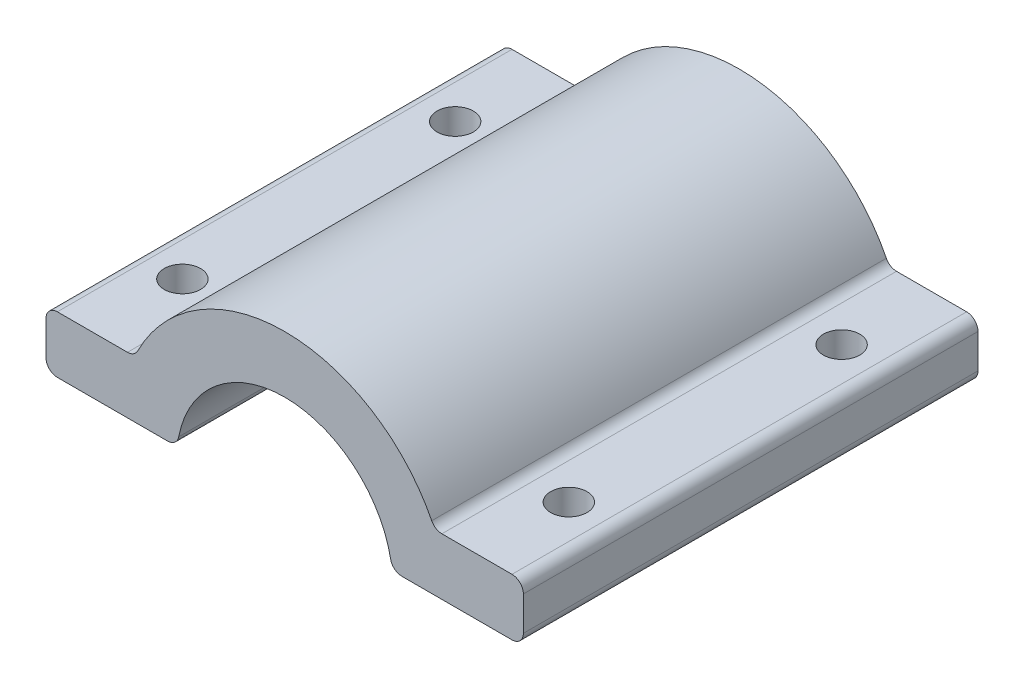
ISO-10303-21;
HEADER;
FILE_DESCRIPTION(('STEP AP214'),'2;1');
FILE_NAME('part.step','',(''),(''),'','','');
FILE_SCHEMA(('AUTOMOTIVE_DESIGN { 1 0 10303 214 1 1 1 1 }'));
ENDSEC;
DATA;
#1=APPLICATION_CONTEXT('core data for automotive mechanical design processes');
#2=APPLICATION_PROTOCOL_DEFINITION('international standard','automotive_design',2000,#1);
#3=PRODUCT_CONTEXT('',#1,'mechanical');
#4=PRODUCT('Part','Part','',(#3));
#5=PRODUCT_RELATED_PRODUCT_CATEGORY('part','',(#4));
#6=PRODUCT_DEFINITION_FORMATION('','',#4);
#7=PRODUCT_DEFINITION_CONTEXT('part definition',#1,'design');
#8=PRODUCT_DEFINITION('design','',#6,#7);
#9=PRODUCT_DEFINITION_SHAPE('','',#8);
#10=(LENGTH_UNIT() NAMED_UNIT(*) SI_UNIT(.MILLI.,.METRE.));
#11=(NAMED_UNIT(*) PLANE_ANGLE_UNIT() SI_UNIT($,.RADIAN.));
#12=(NAMED_UNIT(*) SI_UNIT($,.STERADIAN.) SOLID_ANGLE_UNIT());
#13=UNCERTAINTY_MEASURE_WITH_UNIT(LENGTH_MEASURE(1.E-05),#10,'distance_accuracy_value','');
#14=(GEOMETRIC_REPRESENTATION_CONTEXT(3) GLOBAL_UNCERTAINTY_ASSIGNED_CONTEXT((#13)) GLOBAL_UNIT_ASSIGNED_CONTEXT((#10,
#11,#12)) REPRESENTATION_CONTEXT('',''));
#15=CARTESIAN_POINT('',(0.,0.,0.));
#16=DIRECTION('',(0.,0.,1.));
#17=DIRECTION('',(1.,0.,0.));
#18=AXIS2_PLACEMENT_3D('',#15,#16,#17);
#19=CARTESIAN_POINT('',(13.8293166859393,7.,40.));
#20=DIRECTION('',(0.,0.,-1.));
#21=DIRECTION('',(-1.,0.,0.));
#22=AXIS2_PLACEMENT_3D('',#19,#20,#21);
#23=CYLINDRICAL_SURFACE('',#22,1.);
#24=CARTESIAN_POINT('',(13.8293166859393,7.,0.));
#25=DIRECTION('',(0.,0.,-1.));
#26=DIRECTION('',(1.,0.,0.));
#27=AXIS2_PLACEMENT_3D('',#24,#25,#26);
#28=CIRCLE('',#27,1.);
#29=CARTESIAN_POINT('',(13.8293166859393,6.,0.));
#30=VERTEX_POINT('',#29);
#31=CARTESIAN_POINT('',(12.9371027062013,6.54838709677419,0.));
#32=VERTEX_POINT('',#31);
#33=EDGE_CURVE('E183',#30,#32,#28,.T.);
#34=ORIENTED_EDGE('',*,*,#33,.T.);
#35=DIRECTION('',(0.,0.,-1.));
#36=VECTOR('',#35,1.);
#37=CARTESIAN_POINT('',(12.9371027062013,6.54838709677419,40.));
#38=LINE('',#37,#36);
#39=CARTESIAN_POINT('',(12.9371027062013,6.54838709677419,40.));
#40=VERTEX_POINT('',#39);
#41=EDGE_CURVE('E11',#40,#32,#38,.T.);
#42=ORIENTED_EDGE('',*,*,#41,.F.);
#43=CARTESIAN_POINT('',(13.8293166859393,7.,40.));
#44=DIRECTION('',(0.,0.,-1.));
#45=DIRECTION('',(1.,0.,0.));
#46=AXIS2_PLACEMENT_3D('',#43,#44,#45);
#47=CIRCLE('',#46,1.);
#48=CARTESIAN_POINT('',(13.8293166859393,6.,40.));
#49=VERTEX_POINT('',#48);
#50=EDGE_CURVE('E215',#49,#40,#47,.T.);
#51=ORIENTED_EDGE('',*,*,#50,.F.);
#52=DIRECTION('',(0.,0.,-1.));
#53=VECTOR('',#52,1.);
#54=CARTESIAN_POINT('',(13.8293166859393,6.,40.));
#55=LINE('',#54,#53);
#56=EDGE_CURVE('E179',#49,#30,#55,.T.);
#57=ORIENTED_EDGE('',*,*,#56,.T.);
#58=EDGE_LOOP('',(#34,#42,#51,#57));
#59=FACE_BOUND('',#58,.T.);
#60=ADVANCED_FACE('F37',(#59),#23,.F.);
#61=CARTESIAN_POINT('',(0.,0.,40.));
#62=DIRECTION('',(0.,0.,-1.));
#63=DIRECTION('',(-1.,0.,0.));
#64=AXIS2_PLACEMENT_3D('',#61,#62,#63);
#65=CYLINDRICAL_SURFACE('',#64,14.5);
#66=CARTESIAN_POINT('',(0.,0.,0.));
#67=DIRECTION('',(0.,0.,1.));
#68=DIRECTION('',(1.,0.,0.));
#69=AXIS2_PLACEMENT_3D('',#66,#67,#68);
#70=CIRCLE('',#69,14.5);
#71=CARTESIAN_POINT('',(-12.9371027062013,6.54838709677419,0.));
#72=VERTEX_POINT('',#71);
#73=EDGE_CURVE('E186',#32,#72,#70,.T.);
#74=ORIENTED_EDGE('',*,*,#73,.T.);
#75=DIRECTION('',(0.,0.,-1.));
#76=VECTOR('',#75,1.);
#77=CARTESIAN_POINT('',(-12.9371027062013,6.54838709677419,40.));
#78=LINE('',#77,#76);
#79=CARTESIAN_POINT('',(-12.9371027062013,6.54838709677419,40.));
#80=VERTEX_POINT('',#79);
#81=EDGE_CURVE('E46',#80,#72,#78,.T.);
#82=ORIENTED_EDGE('',*,*,#81,.F.);
#83=CARTESIAN_POINT('',(0.,0.,40.));
#84=DIRECTION('',(0.,0.,1.));
#85=DIRECTION('',(1.,0.,0.));
#86=AXIS2_PLACEMENT_3D('',#83,#84,#85);
#87=CIRCLE('',#86,14.5);
#88=EDGE_CURVE('E122',#40,#80,#87,.T.);
#89=ORIENTED_EDGE('',*,*,#88,.F.);
#90=ORIENTED_EDGE('',*,*,#41,.T.);
#91=EDGE_LOOP('',(#74,#82,#89,#90));
#92=FACE_BOUND('',#91,.T.);
#93=ADVANCED_FACE('F317',(#92),#65,.T.);
#94=CARTESIAN_POINT('',(-13.8293166859393,7.,40.));
#95=DIRECTION('',(0.,0.,-1.));
#96=DIRECTION('',(-1.,0.,0.));
#97=AXIS2_PLACEMENT_3D('',#94,#95,#96);
#98=CYLINDRICAL_SURFACE('',#97,1.);
#99=CARTESIAN_POINT('',(-13.8293166859393,7.,0.));
#100=DIRECTION('',(0.,0.,-1.));
#101=DIRECTION('',(1.,0.,0.));
#102=AXIS2_PLACEMENT_3D('',#99,#100,#101);
#103=CIRCLE('',#102,1.);
#104=CARTESIAN_POINT('',(-13.8293166859393,6.,0.));
#105=VERTEX_POINT('',#104);
#106=EDGE_CURVE('E188',#72,#105,#103,.T.);
#107=ORIENTED_EDGE('',*,*,#106,.T.);
#108=DIRECTION('',(0.,0.,-1.));
#109=VECTOR('',#108,1.);
#110=CARTESIAN_POINT('',(-13.8293166859393,6.,40.));
#111=LINE('',#110,#109);
#112=CARTESIAN_POINT('',(-13.8293166859393,6.,40.));
#113=VERTEX_POINT('',#112);
#114=EDGE_CURVE('E246',#113,#105,#111,.T.);
#115=ORIENTED_EDGE('',*,*,#114,.F.);
#116=CARTESIAN_POINT('',(-13.8293166859393,7.,40.));
#117=DIRECTION('',(0.,0.,-1.));
#118=DIRECTION('',(1.,0.,0.));
#119=AXIS2_PLACEMENT_3D('',#116,#117,#118);
#120=CIRCLE('',#119,1.);
#121=EDGE_CURVE('E268',#80,#113,#120,.T.);
#122=ORIENTED_EDGE('',*,*,#121,.F.);
#123=ORIENTED_EDGE('',*,*,#81,.T.);
#124=EDGE_LOOP('',(#107,#115,#122,#123));
#125=FACE_BOUND('',#124,.T.);
#126=ADVANCED_FACE('F321',(#125),#98,.F.);
#127=CARTESIAN_POINT('',(-20.,6.,40.));
#128=DIRECTION('',(0.,-1.,0.));
#129=DIRECTION('',(0.,0.,-1.));
#130=AXIS2_PLACEMENT_3D('',#127,#128,#129);
#131=PLANE('',#130);
#132=CARTESIAN_POINT('',(-17.,6.,32.));
#133=DIRECTION('',(0.,1.,0.));
#134=DIRECTION('',(0.,0.,1.));
#135=AXIS2_PLACEMENT_3D('',#132,#133,#134);
#136=CIRCLE('',#135,1.60000000000001);
#137=CARTESIAN_POINT('',(-17.,6.,33.6));
#138=VERTEX_POINT('',#137);
#139=EDGE_CURVE('E461',#138,#138,#136,.T.);
#140=ORIENTED_EDGE('',*,*,#139,.F.);
#141=EDGE_LOOP('',(#140));
#142=FACE_BOUND('',#141,.T.);
#143=CARTESIAN_POINT('',(-17.,6.,8.));
#144=DIRECTION('',(0.,1.,0.));
#145=DIRECTION('',(0.,0.,1.));
#146=AXIS2_PLACEMENT_3D('',#143,#144,#145);
#147=CIRCLE('',#146,1.6);
#148=CARTESIAN_POINT('',(-17.,6.,9.6));
#149=VERTEX_POINT('',#148);
#150=EDGE_CURVE('E262',#149,#149,#147,.T.);
#151=ORIENTED_EDGE('',*,*,#150,.F.);
#152=EDGE_LOOP('',(#151));
#153=FACE_BOUND('',#152,.T.);
#154=DIRECTION('',(-1.,0.,0.));
#155=VECTOR('',#154,1.);
#156=CARTESIAN_POINT('',(-20.,6.,0.));
#157=LINE('',#156,#155);
#158=CARTESIAN_POINT('',(-20.,6.,0.));
#159=VERTEX_POINT('',#158);
#160=EDGE_CURVE('E190',#105,#159,#157,.T.);
#161=ORIENTED_EDGE('',*,*,#160,.T.);
#162=DIRECTION('',(0.,0.,-1.));
#163=VECTOR('',#162,1.);
#164=CARTESIAN_POINT('',(-20.,6.,40.));
#165=LINE('',#164,#163);
#166=CARTESIAN_POINT('',(-20.,6.,40.));
#167=VERTEX_POINT('',#166);
#168=EDGE_CURVE('E243',#167,#159,#165,.T.);
#169=ORIENTED_EDGE('',*,*,#168,.F.);
#170=DIRECTION('',(-1.,0.,0.));
#171=VECTOR('',#170,1.);
#172=CARTESIAN_POINT('',(-20.,6.,40.));
#173=LINE('',#172,#171);
#174=EDGE_CURVE('E270',#113,#167,#173,.T.);
#175=ORIENTED_EDGE('',*,*,#174,.F.);
#176=ORIENTED_EDGE('',*,*,#114,.T.);
#177=EDGE_LOOP('',(#161,#169,#175,#176));
#178=FACE_BOUND('',#177,.T.);
#179=ADVANCED_FACE('F325',(#142,#153,#178),#131,.F.);
#180=CARTESIAN_POINT('',(-20.,5.,40.));
#181=DIRECTION('',(0.,0.,-1.));
#182=DIRECTION('',(-1.,0.,0.));
#183=AXIS2_PLACEMENT_3D('',#180,#181,#182);
#184=CYLINDRICAL_SURFACE('',#183,1.);
#185=CARTESIAN_POINT('',(-20.,5.,0.));
#186=DIRECTION('',(0.,0.,1.));
#187=DIRECTION('',(1.,0.,0.));
#188=AXIS2_PLACEMENT_3D('',#185,#186,#187);
#189=CIRCLE('',#188,1.);
#190=CARTESIAN_POINT('',(-21.,5.,0.));
#191=VERTEX_POINT('',#190);
#192=EDGE_CURVE('E192',#159,#191,#189,.T.);
#193=ORIENTED_EDGE('',*,*,#192,.T.);
#194=DIRECTION('',(0.,0.,-1.));
#195=VECTOR('',#194,1.);
#196=CARTESIAN_POINT('',(-21.,5.,40.));
#197=LINE('',#196,#195);
#198=CARTESIAN_POINT('',(-21.,5.,40.));
#199=VERTEX_POINT('',#198);
#200=EDGE_CURVE('E240',#199,#191,#197,.T.);
#201=ORIENTED_EDGE('',*,*,#200,.F.);
#202=CARTESIAN_POINT('',(-20.,5.,40.));
#203=DIRECTION('',(0.,0.,1.));
#204=DIRECTION('',(1.,0.,0.));
#205=AXIS2_PLACEMENT_3D('',#202,#203,#204);
#206=CIRCLE('',#205,1.);
#207=EDGE_CURVE('E272',#167,#199,#206,.T.);
#208=ORIENTED_EDGE('',*,*,#207,.F.);
#209=ORIENTED_EDGE('',*,*,#168,.T.);
#210=EDGE_LOOP('',(#193,#201,#208,#209));
#211=FACE_BOUND('',#210,.T.);
#212=ADVANCED_FACE('F331',(#211),#184,.T.);
#213=CARTESIAN_POINT('',(-21.,5.,40.));
#214=DIRECTION('',(1.,0.,0.));
#215=DIRECTION('',(0.,0.,-1.));
#216=AXIS2_PLACEMENT_3D('',#213,#214,#215);
#217=PLANE('',#216);
#218=DIRECTION('',(0.,-1.,0.));
#219=VECTOR('',#218,1.);
#220=CARTESIAN_POINT('',(-21.,5.,0.));
#221=LINE('',#220,#219);
#222=CARTESIAN_POINT('',(-21.,2.,0.));
#223=VERTEX_POINT('',#222);
#224=EDGE_CURVE('E194',#191,#223,#221,.T.);
#225=ORIENTED_EDGE('',*,*,#224,.T.);
#226=DIRECTION('',(0.,0.,-1.));
#227=VECTOR('',#226,1.);
#228=CARTESIAN_POINT('',(-21.,2.,40.));
#229=LINE('',#228,#227);
#230=CARTESIAN_POINT('',(-21.,2.,40.));
#231=VERTEX_POINT('',#230);
#232=EDGE_CURVE('E237',#231,#223,#229,.T.);
#233=ORIENTED_EDGE('',*,*,#232,.F.);
#234=DIRECTION('',(0.,-1.,0.));
#235=VECTOR('',#234,1.);
#236=CARTESIAN_POINT('',(-21.,5.,40.));
#237=LINE('',#236,#235);
#238=EDGE_CURVE('E274',#199,#231,#237,.T.);
#239=ORIENTED_EDGE('',*,*,#238,.F.);
#240=ORIENTED_EDGE('',*,*,#200,.T.);
#241=EDGE_LOOP('',(#225,#233,#239,#240));
#242=FACE_BOUND('',#241,.T.);
#243=ADVANCED_FACE('F335',(#242),#217,.F.);
#244=CARTESIAN_POINT('',(-20.,2.,40.));
#245=DIRECTION('',(0.,0.,-1.));
#246=DIRECTION('',(-1.,0.,0.));
#247=AXIS2_PLACEMENT_3D('',#244,#245,#246);
#248=CYLINDRICAL_SURFACE('',#247,1.);
#249=CARTESIAN_POINT('',(-20.,2.,0.));
#250=DIRECTION('',(0.,0.,1.));
#251=DIRECTION('',(1.,0.,0.));
#252=AXIS2_PLACEMENT_3D('',#249,#250,#251);
#253=CIRCLE('',#252,1.);
#254=CARTESIAN_POINT('',(-20.,1.,0.));
#255=VERTEX_POINT('',#254);
#256=EDGE_CURVE('E196',#223,#255,#253,.T.);
#257=ORIENTED_EDGE('',*,*,#256,.T.);
#258=DIRECTION('',(0.,0.,-1.));
#259=VECTOR('',#258,1.);
#260=CARTESIAN_POINT('',(-20.,1.,40.));
#261=LINE('',#260,#259);
#262=CARTESIAN_POINT('',(-20.,1.,40.));
#263=VERTEX_POINT('',#262);
#264=EDGE_CURVE('E234',#263,#255,#261,.T.);
#265=ORIENTED_EDGE('',*,*,#264,.F.);
#266=CARTESIAN_POINT('',(-20.,2.,40.));
#267=DIRECTION('',(0.,0.,1.));
#268=DIRECTION('',(1.,0.,0.));
#269=AXIS2_PLACEMENT_3D('',#266,#267,#268);
#270=CIRCLE('',#269,1.);
#271=EDGE_CURVE('E276',#231,#263,#270,.T.);
#272=ORIENTED_EDGE('',*,*,#271,.F.);
#273=ORIENTED_EDGE('',*,*,#232,.T.);
#274=EDGE_LOOP('',(#257,#265,#272,#273));
#275=FACE_BOUND('',#274,.T.);
#276=ADVANCED_FACE('F339',(#275),#248,.T.);
#277=CARTESIAN_POINT('',(-14.4654761414894,1.,40.));
#278=DIRECTION('',(0.,1.,0.));
#279=DIRECTION('',(0.,0.,1.));
#280=AXIS2_PLACEMENT_3D('',#277,#278,#279);
#281=PLANE('',#280);
#282=CARTESIAN_POINT('',(-17.,1.,32.));
#283=DIRECTION('',(0.,1.,0.));
#284=DIRECTION('',(0.,0.,1.));
#285=AXIS2_PLACEMENT_3D('',#282,#283,#284);
#286=CIRCLE('',#285,1.60000000000001);
#287=CARTESIAN_POINT('',(-17.,1.,33.6));
#288=VERTEX_POINT('',#287);
#289=EDGE_CURVE('E40',#288,#288,#286,.T.);
#290=ORIENTED_EDGE('',*,*,#289,.T.);
#291=EDGE_LOOP('',(#290));
#292=FACE_BOUND('',#291,.T.);
#293=CARTESIAN_POINT('',(-17.,1.,8.));
#294=DIRECTION('',(0.,1.,0.));
#295=DIRECTION('',(0.,0.,1.));
#296=AXIS2_PLACEMENT_3D('',#293,#294,#295);
#297=CIRCLE('',#296,1.6);
#298=CARTESIAN_POINT('',(-17.,1.,9.6));
#299=VERTEX_POINT('',#298);
#300=EDGE_CURVE('E250',#299,#299,#297,.T.);
#301=ORIENTED_EDGE('',*,*,#300,.T.);
#302=EDGE_LOOP('',(#301));
#303=FACE_BOUND('',#302,.T.);
#304=DIRECTION('',(1.,0.,0.));
#305=VECTOR('',#304,1.);
#306=CARTESIAN_POINT('',(-14.4654761414894,1.,0.));
#307=LINE('',#306,#305);
#308=CARTESIAN_POINT('',(-10.3077640640442,1.,0.));
#309=VERTEX_POINT('',#308);
#310=EDGE_CURVE('E199',#255,#309,#307,.T.);
#311=ORIENTED_EDGE('',*,*,#310,.T.);
#312=DIRECTION('',(0.,0.,-1.));
#313=VECTOR('',#312,1.);
#314=CARTESIAN_POINT('',(-10.3077640640442,1.,40.));
#315=LINE('',#314,#313);
#316=CARTESIAN_POINT('',(-10.3077640640442,1.,40.));
#317=VERTEX_POINT('',#316);
#318=EDGE_CURVE('E231',#317,#309,#315,.T.);
#319=ORIENTED_EDGE('',*,*,#318,.F.);
#320=DIRECTION('',(1.,0.,0.));
#321=VECTOR('',#320,1.);
#322=CARTESIAN_POINT('',(-20.,1.,40.));
#323=LINE('',#322,#321);
#324=EDGE_CURVE('E278',#263,#317,#323,.T.);
#325=ORIENTED_EDGE('',*,*,#324,.F.);
#326=ORIENTED_EDGE('',*,*,#264,.T.);
#327=EDGE_LOOP('',(#311,#319,#325,#326));
#328=FACE_BOUND('',#327,.T.);
#329=ADVANCED_FACE('F343',(#292,#303,#328),#281,.F.);
#330=CARTESIAN_POINT('',(-10.3077640640442,2.,40.));
#331=DIRECTION('',(0.,0.,-1.));
#332=DIRECTION('',(-1.,0.,0.));
#333=AXIS2_PLACEMENT_3D('',#330,#331,#332);
#334=CYLINDRICAL_SURFACE('',#333,1.);
#335=CARTESIAN_POINT('',(-10.3077640640442,2.,0.));
#336=DIRECTION('',(0.,0.,1.));
#337=DIRECTION('',(-1.,0.,0.));
#338=AXIS2_PLACEMENT_3D('',#335,#336,#337);
#339=CIRCLE('',#338,1.);
#340=CARTESIAN_POINT('',(-9.3260722484209,1.80952380952381,0.));
#341=VERTEX_POINT('',#340);
#342=EDGE_CURVE('E201',#309,#341,#339,.T.);
#343=ORIENTED_EDGE('',*,*,#342,.T.);
#344=DIRECTION('',(0.,0.,-1.));
#345=VECTOR('',#344,1.);
#346=CARTESIAN_POINT('',(-9.3260722484209,1.80952380952381,40.));
#347=LINE('',#346,#345);
#348=CARTESIAN_POINT('',(-9.3260722484209,1.80952380952381,40.));
#349=VERTEX_POINT('',#348);
#350=EDGE_CURVE('E228',#349,#341,#347,.T.);
#351=ORIENTED_EDGE('',*,*,#350,.F.);
#352=CARTESIAN_POINT('',(-10.3077640640442,2.,40.));
#353=DIRECTION('',(0.,0.,1.));
#354=DIRECTION('',(-1.,0.,0.));
#355=AXIS2_PLACEMENT_3D('',#352,#353,#354);
#356=CIRCLE('',#355,1.);
#357=EDGE_CURVE('E280',#317,#349,#356,.T.);
#358=ORIENTED_EDGE('',*,*,#357,.F.);
#359=ORIENTED_EDGE('',*,*,#318,.T.);
#360=EDGE_LOOP('',(#343,#351,#358,#359));
#361=FACE_BOUND('',#360,.T.);
#362=ADVANCED_FACE('F347',(#361),#334,.T.);
#363=CARTESIAN_POINT('',(0.,0.,40.));
#364=DIRECTION('',(0.,0.,-1.));
#365=DIRECTION('',(-1.,0.,0.));
#366=AXIS2_PLACEMENT_3D('',#363,#364,#365);
#367=CYLINDRICAL_SURFACE('',#366,9.5);
#368=CARTESIAN_POINT('',(0.,0.,0.));
#369=DIRECTION('',(0.,0.,-1.));
#370=DIRECTION('',(1.,0.,0.));
#371=AXIS2_PLACEMENT_3D('',#368,#369,#370);
#372=CIRCLE('',#371,9.5);
#373=CARTESIAN_POINT('',(9.3260722484209,1.80952380952381,0.));
#374=VERTEX_POINT('',#373);
#375=EDGE_CURVE('E203',#341,#374,#372,.T.);
#376=ORIENTED_EDGE('',*,*,#375,.T.);
#377=DIRECTION('',(0.,0.,-1.));
#378=VECTOR('',#377,1.);
#379=CARTESIAN_POINT('',(9.3260722484209,1.80952380952381,40.));
#380=LINE('',#379,#378);
#381=CARTESIAN_POINT('',(9.3260722484209,1.80952380952381,40.));
#382=VERTEX_POINT('',#381);
#383=EDGE_CURVE('E225',#382,#374,#380,.T.);
#384=ORIENTED_EDGE('',*,*,#383,.F.);
#385=CARTESIAN_POINT('',(0.,0.,40.));
#386=DIRECTION('',(0.,0.,-1.));
#387=DIRECTION('',(1.,0.,0.));
#388=AXIS2_PLACEMENT_3D('',#385,#386,#387);
#389=CIRCLE('',#388,9.5);
#390=EDGE_CURVE('E282',#349,#382,#389,.T.);
#391=ORIENTED_EDGE('',*,*,#390,.F.);
#392=ORIENTED_EDGE('',*,*,#350,.T.);
#393=EDGE_LOOP('',(#376,#384,#391,#392));
#394=FACE_BOUND('',#393,.T.);
#395=ADVANCED_FACE('F351',(#394),#367,.F.);
#396=CARTESIAN_POINT('',(10.3077640640442,2.,40.));
#397=DIRECTION('',(0.,0.,-1.));
#398=DIRECTION('',(-1.,0.,0.));
#399=AXIS2_PLACEMENT_3D('',#396,#397,#398);
#400=CYLINDRICAL_SURFACE('',#399,1.);
#401=CARTESIAN_POINT('',(10.3077640640442,2.,0.));
#402=DIRECTION('',(0.,0.,1.));
#403=DIRECTION('',(1.,0.,0.));
#404=AXIS2_PLACEMENT_3D('',#401,#402,#403);
#405=CIRCLE('',#404,1.);
#406=CARTESIAN_POINT('',(10.3077640640442,1.,0.));
#407=VERTEX_POINT('',#406);
#408=EDGE_CURVE('E205',#374,#407,#405,.T.);
#409=ORIENTED_EDGE('',*,*,#408,.T.);
#410=DIRECTION('',(0.,0.,-1.));
#411=VECTOR('',#410,1.);
#412=CARTESIAN_POINT('',(10.3077640640442,1.,40.));
#413=LINE('',#412,#411);
#414=CARTESIAN_POINT('',(10.3077640640442,1.,40.));
#415=VERTEX_POINT('',#414);
#416=EDGE_CURVE('E222',#415,#407,#413,.T.);
#417=ORIENTED_EDGE('',*,*,#416,.F.);
#418=CARTESIAN_POINT('',(10.3077640640442,2.,40.));
#419=DIRECTION('',(0.,0.,1.));
#420=DIRECTION('',(1.,0.,0.));
#421=AXIS2_PLACEMENT_3D('',#418,#419,#420);
#422=CIRCLE('',#421,1.);
#423=EDGE_CURVE('E284',#382,#415,#422,.T.);
#424=ORIENTED_EDGE('',*,*,#423,.F.);
#425=ORIENTED_EDGE('',*,*,#383,.T.);
#426=EDGE_LOOP('',(#409,#417,#424,#425));
#427=FACE_BOUND('',#426,.T.);
#428=ADVANCED_FACE('F355',(#427),#400,.T.);
#429=CARTESIAN_POINT('',(20.,1.,40.));
#430=DIRECTION('',(0.,1.,0.));
#431=DIRECTION('',(-1.,0.,0.));
#432=AXIS2_PLACEMENT_3D('',#429,#430,#431);
#433=PLANE('',#432);
#434=CARTESIAN_POINT('',(17.,1.,32.));
#435=DIRECTION('',(0.,1.,0.));
#436=DIRECTION('',(-1.,0.,0.));
#437=AXIS2_PLACEMENT_3D('',#434,#435,#436);
#438=CIRCLE('',#437,1.6);
#439=CARTESIAN_POINT('',(15.4,1.,32.));
#440=VERTEX_POINT('',#439);
#441=EDGE_CURVE('E252',#440,#440,#438,.T.);
#442=ORIENTED_EDGE('',*,*,#441,.T.);
#443=EDGE_LOOP('',(#442));
#444=FACE_BOUND('',#443,.T.);
#445=CARTESIAN_POINT('',(17.,1.,8.));
#446=DIRECTION('',(0.,1.,0.));
#447=DIRECTION('',(-1.,0.,0.));
#448=AXIS2_PLACEMENT_3D('',#445,#446,#447);
#449=CIRCLE('',#448,1.6);
#450=CARTESIAN_POINT('',(15.4,1.,8.));
#451=VERTEX_POINT('',#450);
#452=EDGE_CURVE('E257',#451,#451,#449,.T.);
#453=ORIENTED_EDGE('',*,*,#452,.T.);
#454=EDGE_LOOP('',(#453));
#455=FACE_BOUND('',#454,.T.);
#456=DIRECTION('',(1.,0.,0.));
#457=VECTOR('',#456,1.);
#458=CARTESIAN_POINT('',(20.,1.,0.));
#459=LINE('',#458,#457);
#460=CARTESIAN_POINT('',(20.,1.,0.));
#461=VERTEX_POINT('',#460);
#462=EDGE_CURVE('E208',#407,#461,#459,.T.);
#463=ORIENTED_EDGE('',*,*,#462,.T.);
#464=DIRECTION('',(0.,0.,-1.));
#465=VECTOR('',#464,1.);
#466=CARTESIAN_POINT('',(20.,1.,40.));
#467=LINE('',#466,#465);
#468=CARTESIAN_POINT('',(20.,1.,40.));
#469=VERTEX_POINT('',#468);
#470=EDGE_CURVE('E219',#469,#461,#467,.T.);
#471=ORIENTED_EDGE('',*,*,#470,.F.);
#472=DIRECTION('',(1.,0.,0.));
#473=VECTOR('',#472,1.);
#474=CARTESIAN_POINT('',(10.3077640640442,1.,40.));
#475=LINE('',#474,#473);
#476=EDGE_CURVE('E286',#415,#469,#475,.T.);
#477=ORIENTED_EDGE('',*,*,#476,.F.);
#478=ORIENTED_EDGE('',*,*,#416,.T.);
#479=EDGE_LOOP('',(#463,#471,#477,#478));
#480=FACE_BOUND('',#479,.T.);
#481=ADVANCED_FACE('F292',(#444,#455,#480),#433,.F.);
#482=CARTESIAN_POINT('',(20.,2.,40.));
#483=DIRECTION('',(0.,0.,-1.));
#484=DIRECTION('',(-1.,0.,0.));
#485=AXIS2_PLACEMENT_3D('',#482,#483,#484);
#486=CYLINDRICAL_SURFACE('',#485,1.);
#487=CARTESIAN_POINT('',(20.,2.,0.));
#488=DIRECTION('',(0.,0.,1.));
#489=DIRECTION('',(1.,0.,0.));
#490=AXIS2_PLACEMENT_3D('',#487,#488,#489);
#491=CIRCLE('',#490,1.);
#492=CARTESIAN_POINT('',(21.,2.,0.));
#493=VERTEX_POINT('',#492);
#494=EDGE_CURVE('E210',#461,#493,#491,.T.);
#495=ORIENTED_EDGE('',*,*,#494,.T.);
#496=DIRECTION('',(0.,0.,-1.));
#497=VECTOR('',#496,1.);
#498=CARTESIAN_POINT('',(21.,2.,40.));
#499=LINE('',#498,#497);
#500=CARTESIAN_POINT('',(21.,2.,40.));
#501=VERTEX_POINT('',#500);
#502=EDGE_CURVE('E174',#501,#493,#499,.T.);
#503=ORIENTED_EDGE('',*,*,#502,.F.);
#504=CARTESIAN_POINT('',(20.,2.,40.));
#505=DIRECTION('',(0.,0.,1.));
#506=DIRECTION('',(1.,0.,0.));
#507=AXIS2_PLACEMENT_3D('',#504,#505,#506);
#508=CIRCLE('',#507,1.);
#509=EDGE_CURVE('E165',#469,#501,#508,.T.);
#510=ORIENTED_EDGE('',*,*,#509,.F.);
#511=ORIENTED_EDGE('',*,*,#470,.T.);
#512=EDGE_LOOP('',(#495,#503,#510,#511));
#513=FACE_BOUND('',#512,.T.);
#514=ADVANCED_FACE('F295',(#513),#486,.T.);
#515=CARTESIAN_POINT('',(21.,5.,40.));
#516=DIRECTION('',(-1.,0.,0.));
#517=DIRECTION('',(0.,0.,1.));
#518=AXIS2_PLACEMENT_3D('',#515,#516,#517);
#519=PLANE('',#518);
#520=DIRECTION('',(0.,1.,0.));
#521=VECTOR('',#520,1.);
#522=CARTESIAN_POINT('',(21.,5.,0.));
#523=LINE('',#522,#521);
#524=CARTESIAN_POINT('',(21.,5.,0.));
#525=VERTEX_POINT('',#524);
#526=EDGE_CURVE('E173',#493,#525,#523,.T.);
#527=ORIENTED_EDGE('',*,*,#526,.T.);
#528=DIRECTION('',(0.,0.,-1.));
#529=VECTOR('',#528,1.);
#530=CARTESIAN_POINT('',(21.,5.,40.));
#531=LINE('',#530,#529);
#532=CARTESIAN_POINT('',(21.,5.,40.));
#533=VERTEX_POINT('',#532);
#534=EDGE_CURVE('E170',#533,#525,#531,.T.);
#535=ORIENTED_EDGE('',*,*,#534,.F.);
#536=DIRECTION('',(0.,1.,0.));
#537=VECTOR('',#536,1.);
#538=CARTESIAN_POINT('',(21.,5.,40.));
#539=LINE('',#538,#537);
#540=EDGE_CURVE('E159',#501,#533,#539,.T.);
#541=ORIENTED_EDGE('',*,*,#540,.F.);
#542=ORIENTED_EDGE('',*,*,#502,.T.);
#543=EDGE_LOOP('',(#527,#535,#541,#542));
#544=FACE_BOUND('',#543,.T.);
#545=ADVANCED_FACE('F171',(#544),#519,.F.);
#546=CARTESIAN_POINT('',(20.,5.,40.));
#547=DIRECTION('',(0.,0.,-1.));
#548=DIRECTION('',(-1.,0.,0.));
#549=AXIS2_PLACEMENT_3D('',#546,#547,#548);
#550=CYLINDRICAL_SURFACE('',#549,1.);
#551=CARTESIAN_POINT('',(20.,5.,0.));
#552=DIRECTION('',(0.,0.,1.));
#553=DIRECTION('',(1.,0.,0.));
#554=AXIS2_PLACEMENT_3D('',#551,#552,#553);
#555=CIRCLE('',#554,1.);
#556=CARTESIAN_POINT('',(20.,6.,0.));
#557=VERTEX_POINT('',#556);
#558=EDGE_CURVE('E108',#525,#557,#555,.T.);
#559=ORIENTED_EDGE('',*,*,#558,.T.);
#560=DIRECTION('',(0.,0.,-1.));
#561=VECTOR('',#560,1.);
#562=CARTESIAN_POINT('',(20.,6.,40.));
#563=LINE('',#562,#561);
#564=CARTESIAN_POINT('',(20.,6.,40.));
#565=VERTEX_POINT('',#564);
#566=EDGE_CURVE('E175',#565,#557,#563,.T.);
#567=ORIENTED_EDGE('',*,*,#566,.F.);
#568=CARTESIAN_POINT('',(20.,5.,40.));
#569=DIRECTION('',(0.,0.,1.));
#570=DIRECTION('',(1.,0.,0.));
#571=AXIS2_PLACEMENT_3D('',#568,#569,#570);
#572=CIRCLE('',#571,1.);
#573=EDGE_CURVE('E163',#533,#565,#572,.T.);
#574=ORIENTED_EDGE('',*,*,#573,.F.);
#575=ORIENTED_EDGE('',*,*,#534,.T.);
#576=EDGE_LOOP('',(#559,#567,#574,#575));
#577=FACE_BOUND('',#576,.T.);
#578=ADVANCED_FACE('F177',(#577),#550,.T.);
#579=CARTESIAN_POINT('',(20.,6.,40.));
#580=DIRECTION('',(0.,-1.,0.));
#581=DIRECTION('',(0.,0.,-1.));
#582=AXIS2_PLACEMENT_3D('',#579,#580,#581);
#583=PLANE('',#582);
#584=CARTESIAN_POINT('',(17.,6.,32.));
#585=DIRECTION('',(0.,1.,0.));
#586=DIRECTION('',(0.,0.,1.));
#587=AXIS2_PLACEMENT_3D('',#584,#585,#586);
#588=CIRCLE('',#587,1.6);
#589=CARTESIAN_POINT('',(17.,6.,33.6));
#590=VERTEX_POINT('',#589);
#591=EDGE_CURVE('E488',#590,#590,#588,.T.);
#592=ORIENTED_EDGE('',*,*,#591,.F.);
#593=EDGE_LOOP('',(#592));
#594=FACE_BOUND('',#593,.T.);
#595=CARTESIAN_POINT('',(17.,6.,8.));
#596=DIRECTION('',(0.,1.,0.));
#597=DIRECTION('',(0.,0.,1.));
#598=AXIS2_PLACEMENT_3D('',#595,#596,#597);
#599=CIRCLE('',#598,1.6);
#600=CARTESIAN_POINT('',(17.,6.,9.6));
#601=VERTEX_POINT('',#600);
#602=EDGE_CURVE('E491',#601,#601,#599,.T.);
#603=ORIENTED_EDGE('',*,*,#602,.F.);
#604=EDGE_LOOP('',(#603));
#605=FACE_BOUND('',#604,.T.);
#606=DIRECTION('',(-1.,0.,0.));
#607=VECTOR('',#606,1.);
#608=CARTESIAN_POINT('',(20.,6.,0.));
#609=LINE('',#608,#607);
#610=EDGE_CURVE('E114',#557,#30,#609,.T.);
#611=ORIENTED_EDGE('',*,*,#610,.T.);
#612=ORIENTED_EDGE('',*,*,#56,.F.);
#613=DIRECTION('',(-1.,0.,0.));
#614=VECTOR('',#613,1.);
#615=CARTESIAN_POINT('',(20.,6.,40.));
#616=LINE('',#615,#614);
#617=EDGE_CURVE('E55',#565,#49,#616,.T.);
#618=ORIENTED_EDGE('',*,*,#617,.F.);
#619=ORIENTED_EDGE('',*,*,#566,.T.);
#620=EDGE_LOOP('',(#611,#612,#618,#619));
#621=FACE_BOUND('',#620,.T.);
#622=ADVANCED_FACE('F303',(#594,#605,#621),#583,.F.);
#623=CARTESIAN_POINT('',(13.8293166859393,7.,40.));
#624=DIRECTION('',(0.,0.,1.));
#625=DIRECTION('',(1.,0.,0.));
#626=AXIS2_PLACEMENT_3D('',#623,#624,#625);
#627=PLANE('',#626);
#628=ORIENTED_EDGE('',*,*,#50,.T.);
#629=ORIENTED_EDGE('',*,*,#88,.T.);
#630=ORIENTED_EDGE('',*,*,#121,.T.);
#631=ORIENTED_EDGE('',*,*,#174,.T.);
#632=ORIENTED_EDGE('',*,*,#207,.T.);
#633=ORIENTED_EDGE('',*,*,#238,.T.);
#634=ORIENTED_EDGE('',*,*,#271,.T.);
#635=ORIENTED_EDGE('',*,*,#324,.T.);
#636=ORIENTED_EDGE('',*,*,#357,.T.);
#637=ORIENTED_EDGE('',*,*,#390,.T.);
#638=ORIENTED_EDGE('',*,*,#423,.T.);
#639=ORIENTED_EDGE('',*,*,#476,.T.);
#640=ORIENTED_EDGE('',*,*,#509,.T.);
#641=ORIENTED_EDGE('',*,*,#540,.T.);
#642=ORIENTED_EDGE('',*,*,#573,.T.);
#643=ORIENTED_EDGE('',*,*,#617,.T.);
#644=EDGE_LOOP('',(#628,#629,#630,#631,#632,#633,#634,#635,#636,#637,#638,#639,#640,#641,#642,#643));
#645=FACE_BOUND('',#644,.T.);
#646=ADVANCED_FACE('F161',(#645),#627,.T.);
#647=CARTESIAN_POINT('',(13.8293166859393,7.,0.));
#648=DIRECTION('',(0.,0.,1.));
#649=DIRECTION('',(1.,0.,0.));
#650=AXIS2_PLACEMENT_3D('',#647,#648,#649);
#651=PLANE('',#650);
#652=ORIENTED_EDGE('',*,*,#33,.F.);
#653=ORIENTED_EDGE('',*,*,#610,.F.);
#654=ORIENTED_EDGE('',*,*,#558,.F.);
#655=ORIENTED_EDGE('',*,*,#526,.F.);
#656=ORIENTED_EDGE('',*,*,#494,.F.);
#657=ORIENTED_EDGE('',*,*,#462,.F.);
#658=ORIENTED_EDGE('',*,*,#408,.F.);
#659=ORIENTED_EDGE('',*,*,#375,.F.);
#660=ORIENTED_EDGE('',*,*,#342,.F.);
#661=ORIENTED_EDGE('',*,*,#310,.F.);
#662=ORIENTED_EDGE('',*,*,#256,.F.);
#663=ORIENTED_EDGE('',*,*,#224,.F.);
#664=ORIENTED_EDGE('',*,*,#192,.F.);
#665=ORIENTED_EDGE('',*,*,#160,.F.);
#666=ORIENTED_EDGE('',*,*,#106,.F.);
#667=ORIENTED_EDGE('',*,*,#73,.F.);
#668=EDGE_LOOP('',(#652,#653,#654,#655,#656,#657,#658,#659,#660,#661,#662,#663,#664,#665,#666,#667));
#669=FACE_BOUND('',#668,.T.);
#670=ADVANCED_FACE('F298',(#669),#651,.F.);
#671=CARTESIAN_POINT('',(17.,-34.,8.));
#672=DIRECTION('',(0.,1.,0.));
#673=DIRECTION('',(0.,0.,1.));
#674=AXIS2_PLACEMENT_3D('',#671,#672,#673);
#675=CYLINDRICAL_SURFACE('',#674,1.6);
#676=ORIENTED_EDGE('',*,*,#602,.T.);
#677=EDGE_LOOP('',(#676));
#678=FACE_BOUND('',#677,.T.);
#679=ORIENTED_EDGE('',*,*,#452,.F.);
#680=EDGE_LOOP('',(#679));
#681=FACE_BOUND('',#680,.T.);
#682=ADVANCED_FACE('F389',(#678,#681),#675,.F.);
#683=CARTESIAN_POINT('',(17.,-34.,32.));
#684=DIRECTION('',(0.,1.,0.));
#685=DIRECTION('',(0.,0.,1.));
#686=AXIS2_PLACEMENT_3D('',#683,#684,#685);
#687=CYLINDRICAL_SURFACE('',#686,1.6);
#688=ORIENTED_EDGE('',*,*,#591,.T.);
#689=EDGE_LOOP('',(#688));
#690=FACE_BOUND('',#689,.T.);
#691=ORIENTED_EDGE('',*,*,#441,.F.);
#692=EDGE_LOOP('',(#691));
#693=FACE_BOUND('',#692,.T.);
#694=ADVANCED_FACE('F424',(#690,#693),#687,.F.);
#695=CARTESIAN_POINT('',(-17.,-34.,8.));
#696=DIRECTION('',(0.,1.,0.));
#697=DIRECTION('',(0.,0.,1.));
#698=AXIS2_PLACEMENT_3D('',#695,#696,#697);
#699=CYLINDRICAL_SURFACE('',#698,1.6);
#700=ORIENTED_EDGE('',*,*,#150,.T.);
#701=EDGE_LOOP('',(#700));
#702=FACE_BOUND('',#701,.T.);
#703=ORIENTED_EDGE('',*,*,#300,.F.);
#704=EDGE_LOOP('',(#703));
#705=FACE_BOUND('',#704,.T.);
#706=ADVANCED_FACE('F434',(#702,#705),#699,.F.);
#707=CARTESIAN_POINT('',(-17.,-34.,32.));
#708=DIRECTION('',(0.,1.,0.));
#709=DIRECTION('',(0.,0.,1.));
#710=AXIS2_PLACEMENT_3D('',#707,#708,#709);
#711=CYLINDRICAL_SURFACE('',#710,1.60000000000001);
#712=ORIENTED_EDGE('',*,*,#139,.T.);
#713=EDGE_LOOP('',(#712));
#714=FACE_BOUND('',#713,.T.);
#715=ORIENTED_EDGE('',*,*,#289,.F.);
#716=EDGE_LOOP('',(#715));
#717=FACE_BOUND('',#716,.T.);
#718=ADVANCED_FACE('F444',(#714,#717),#711,.F.);
#719=CLOSED_SHELL('',(#60,#93,#126,#179,#212,#243,#276,#329,#362,#395,#428,#481,#514,#545,#578,
#622,#646,#670,#682,#694,#706,#718));
#720=MANIFOLD_SOLID_BREP('B2',#719);
#721=ADVANCED_BREP_SHAPE_REPRESENTATION('',(#18,#720),#14);
#722=SHAPE_DEFINITION_REPRESENTATION(#9,#721);
ENDSEC;
END-ISO-10303-21;
